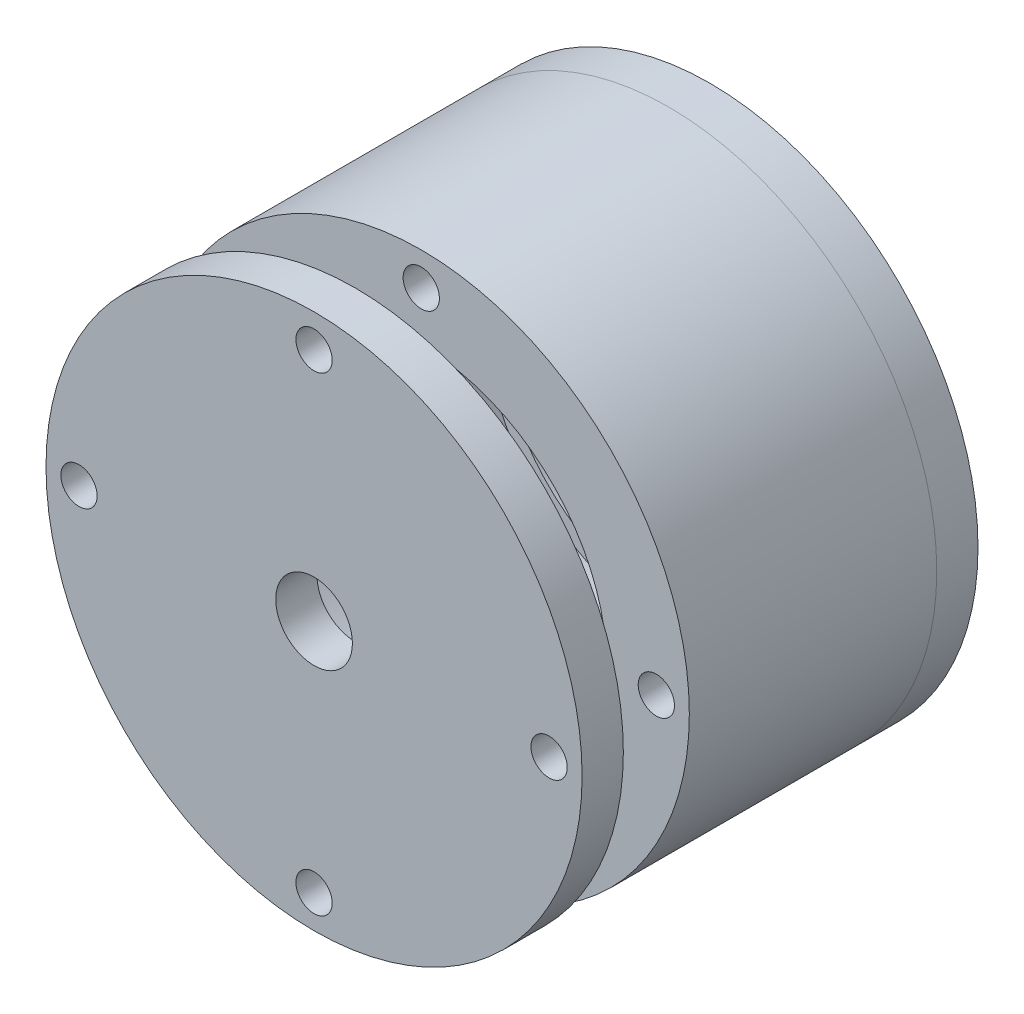
ISO-10303-21;
HEADER;
FILE_DESCRIPTION(('STEP AP214'),'2;1');
FILE_NAME('part.step','',(''),(''),'','','');
FILE_SCHEMA(('AUTOMOTIVE_DESIGN { 1 0 10303 214 1 1 1 1 }'));
ENDSEC;
DATA;
#1=APPLICATION_CONTEXT('core data for automotive mechanical design processes');
#2=APPLICATION_PROTOCOL_DEFINITION('international standard','automotive_design',2000,#1);
#3=PRODUCT_CONTEXT('',#1,'mechanical');
#4=PRODUCT('Part','Part','',(#3));
#5=PRODUCT_RELATED_PRODUCT_CATEGORY('part','',(#4));
#6=PRODUCT_DEFINITION_FORMATION('','',#4);
#7=PRODUCT_DEFINITION_CONTEXT('part definition',#1,'design');
#8=PRODUCT_DEFINITION('design','',#6,#7);
#9=PRODUCT_DEFINITION_SHAPE('','',#8);
#10=(LENGTH_UNIT() NAMED_UNIT(*) SI_UNIT(.MILLI.,.METRE.));
#11=(NAMED_UNIT(*) PLANE_ANGLE_UNIT() SI_UNIT($,.RADIAN.));
#12=(NAMED_UNIT(*) SI_UNIT($,.STERADIAN.) SOLID_ANGLE_UNIT());
#13=UNCERTAINTY_MEASURE_WITH_UNIT(LENGTH_MEASURE(1.E-05),#10,'distance_accuracy_value','');
#14=(GEOMETRIC_REPRESENTATION_CONTEXT(3) GLOBAL_UNCERTAINTY_ASSIGNED_CONTEXT((#13)) GLOBAL_UNIT_ASSIGNED_CONTEXT((#10,
#11,#12)) REPRESENTATION_CONTEXT('',''));
#15=CARTESIAN_POINT('',(0.,0.,0.));
#16=DIRECTION('',(0.,0.,1.));
#17=DIRECTION('',(1.,0.,0.));
#18=AXIS2_PLACEMENT_3D('',#15,#16,#17);
#19=CARTESIAN_POINT('',(0.,0.,-38.));
#20=DIRECTION('',(0.,0.,-1.));
#21=DIRECTION('',(1.,0.,0.));
#22=AXIS2_PLACEMENT_3D('',#19,#20,#21);
#23=PLANE('',#22);
#24=CARTESIAN_POINT('',(33.4966210299385,-33.7547722369169,-38.));
#25=DIRECTION('',(0.,0.,1.));
#26=DIRECTION('',(1.,0.,0.));
#27=AXIS2_PLACEMENT_3D('',#24,#25,#26);
#28=CIRCLE('',#27,4.65);
#29=CARTESIAN_POINT('',(38.1466210299385,-33.7547722369169,-38.));
#30=VERTEX_POINT('',#29);
#31=EDGE_CURVE('E88',#30,#30,#28,.T.);
#32=ORIENTED_EDGE('',*,*,#31,.F.);
#33=EDGE_LOOP('',(#32));
#34=FACE_BOUND('',#33,.T.);
#35=CARTESIAN_POINT('',(33.4966210299385,-33.7547722369169,-38.));
#36=DIRECTION('',(0.,0.,1.));
#37=DIRECTION('',(1.,0.,0.));
#38=AXIS2_PLACEMENT_3D('',#35,#36,#37);
#39=CIRCLE('',#38,15.6);
#40=CARTESIAN_POINT('',(49.0966210299385,-33.7547722369169,-38.));
#41=VERTEX_POINT('',#40);
#42=EDGE_CURVE('E141',#41,#41,#39,.T.);
#43=ORIENTED_EDGE('',*,*,#42,.T.);
#44=EDGE_LOOP('',(#43));
#45=FACE_BOUND('',#44,.T.);
#46=ADVANCED_FACE('F56',(#34,#45),#23,.F.);
#47=CARTESIAN_POINT('',(61.9966210299385,-33.7547722369169,-43.));
#48=DIRECTION('',(0.,0.,1.));
#49=DIRECTION('',(-1.,0.,0.));
#50=AXIS2_PLACEMENT_3D('',#47,#48,#49);
#51=CYLINDRICAL_SURFACE('',#50,2.2);
#52=CARTESIAN_POINT('',(61.9966210299385,-33.7547722369169,-43.));
#53=DIRECTION('',(0.,0.,1.));
#54=DIRECTION('',(1.,0.,0.));
#55=AXIS2_PLACEMENT_3D('',#52,#53,#54);
#56=CIRCLE('',#55,2.2);
#57=CARTESIAN_POINT('',(64.1966210299385,-33.7547722369169,-43.));
#58=VERTEX_POINT('',#57);
#59=EDGE_CURVE('E65',#58,#58,#56,.T.);
#60=ORIENTED_EDGE('',*,*,#59,.F.);
#61=EDGE_LOOP('',(#60));
#62=FACE_BOUND('',#61,.T.);
#63=CARTESIAN_POINT('',(61.9966210299385,-33.7547722369169,-38.));
#64=DIRECTION('',(0.,0.,1.));
#65=DIRECTION('',(1.,0.,0.));
#66=AXIS2_PLACEMENT_3D('',#63,#64,#65);
#67=CIRCLE('',#66,2.2);
#68=CARTESIAN_POINT('',(64.1966210299385,-33.7547722369169,-38.));
#69=VERTEX_POINT('',#68);
#70=EDGE_CURVE('E91',#69,#69,#67,.T.);
#71=ORIENTED_EDGE('',*,*,#70,.T.);
#72=EDGE_LOOP('',(#71));
#73=FACE_BOUND('',#72,.T.);
#74=ADVANCED_FACE('F131',(#62,#73),#51,.F.);
#75=CARTESIAN_POINT('',(33.4966210299385,-33.7547722369169,-43.));
#76=DIRECTION('',(0.,0.,1.));
#77=DIRECTION('',(-1.,0.,0.));
#78=AXIS2_PLACEMENT_3D('',#75,#76,#77);
#79=CYLINDRICAL_SURFACE('',#78,4.65);
#80=CARTESIAN_POINT('',(33.4966210299385,-33.7547722369169,-43.));
#81=DIRECTION('',(0.,0.,1.));
#82=DIRECTION('',(1.,0.,0.));
#83=AXIS2_PLACEMENT_3D('',#80,#81,#82);
#84=CIRCLE('',#83,4.65);
#85=CARTESIAN_POINT('',(38.1466210299385,-33.7547722369169,-43.));
#86=VERTEX_POINT('',#85);
#87=EDGE_CURVE('E72',#86,#86,#84,.T.);
#88=ORIENTED_EDGE('',*,*,#87,.F.);
#89=EDGE_LOOP('',(#88));
#90=FACE_BOUND('',#89,.T.);
#91=ORIENTED_EDGE('',*,*,#31,.T.);
#92=EDGE_LOOP('',(#91));
#93=FACE_BOUND('',#92,.T.);
#94=ADVANCED_FACE('F127',(#90,#93),#79,.F.);
#95=CARTESIAN_POINT('',(33.4966210299385,-62.2547722369169,-43.));
#96=DIRECTION('',(0.,0.,1.));
#97=DIRECTION('',(-1.,0.,0.));
#98=AXIS2_PLACEMENT_3D('',#95,#96,#97);
#99=CYLINDRICAL_SURFACE('',#98,2.2);
#100=CARTESIAN_POINT('',(33.4966210299385,-62.2547722369169,-43.));
#101=DIRECTION('',(0.,0.,1.));
#102=DIRECTION('',(1.,0.,0.));
#103=AXIS2_PLACEMENT_3D('',#100,#101,#102);
#104=CIRCLE('',#103,2.2);
#105=CARTESIAN_POINT('',(35.6966210299385,-62.2547722369169,-43.));
#106=VERTEX_POINT('',#105);
#107=EDGE_CURVE('E112',#106,#106,#104,.T.);
#108=ORIENTED_EDGE('',*,*,#107,.F.);
#109=EDGE_LOOP('',(#108));
#110=FACE_BOUND('',#109,.T.);
#111=CARTESIAN_POINT('',(33.4966210299385,-62.2547722369169,-38.));
#112=DIRECTION('',(0.,0.,1.));
#113=DIRECTION('',(1.,0.,0.));
#114=AXIS2_PLACEMENT_3D('',#111,#112,#113);
#115=CIRCLE('',#114,2.2);
#116=CARTESIAN_POINT('',(35.6966210299385,-62.2547722369169,-38.));
#117=VERTEX_POINT('',#116);
#118=EDGE_CURVE('E84',#117,#117,#115,.T.);
#119=ORIENTED_EDGE('',*,*,#118,.T.);
#120=EDGE_LOOP('',(#119));
#121=FACE_BOUND('',#120,.T.);
#122=ADVANCED_FACE('F130',(#110,#121),#99,.F.);
#123=CARTESIAN_POINT('',(4.9966210299385,-33.7547722369169,-43.));
#124=DIRECTION('',(0.,0.,1.));
#125=DIRECTION('',(-1.,0.,0.));
#126=AXIS2_PLACEMENT_3D('',#123,#124,#125);
#127=CYLINDRICAL_SURFACE('',#126,2.2);
#128=CARTESIAN_POINT('',(4.9966210299385,-33.7547722369169,-43.));
#129=DIRECTION('',(0.,0.,1.));
#130=DIRECTION('',(1.,0.,0.));
#131=AXIS2_PLACEMENT_3D('',#128,#129,#130);
#132=CIRCLE('',#131,2.2);
#133=CARTESIAN_POINT('',(7.1966210299385,-33.7547722369169,-43.));
#134=VERTEX_POINT('',#133);
#135=EDGE_CURVE('E105',#134,#134,#132,.T.);
#136=ORIENTED_EDGE('',*,*,#135,.F.);
#137=EDGE_LOOP('',(#136));
#138=FACE_BOUND('',#137,.T.);
#139=CARTESIAN_POINT('',(4.9966210299385,-33.7547722369169,-38.));
#140=DIRECTION('',(0.,0.,1.));
#141=DIRECTION('',(1.,0.,0.));
#142=AXIS2_PLACEMENT_3D('',#139,#140,#141);
#143=CIRCLE('',#142,2.2);
#144=CARTESIAN_POINT('',(7.1966210299385,-33.7547722369169,-38.));
#145=VERTEX_POINT('',#144);
#146=EDGE_CURVE('E80',#145,#145,#143,.T.);
#147=ORIENTED_EDGE('',*,*,#146,.T.);
#148=EDGE_LOOP('',(#147));
#149=FACE_BOUND('',#148,.T.);
#150=ADVANCED_FACE('F166',(#138,#149),#127,.F.);
#151=CARTESIAN_POINT('',(33.4966210299385,-5.25477223691686,-43.));
#152=DIRECTION('',(0.,0.,1.));
#153=DIRECTION('',(-1.,0.,0.));
#154=AXIS2_PLACEMENT_3D('',#151,#152,#153);
#155=CYLINDRICAL_SURFACE('',#154,2.2);
#156=CARTESIAN_POINT('',(33.4966210299385,-5.25477223691686,-43.));
#157=DIRECTION('',(0.,0.,1.));
#158=DIRECTION('',(1.,0.,0.));
#159=AXIS2_PLACEMENT_3D('',#156,#157,#158);
#160=CIRCLE('',#159,2.2);
#161=CARTESIAN_POINT('',(35.6966210299385,-5.25477223691686,-43.));
#162=VERTEX_POINT('',#161);
#163=EDGE_CURVE('E100',#162,#162,#160,.T.);
#164=ORIENTED_EDGE('',*,*,#163,.F.);
#165=EDGE_LOOP('',(#164));
#166=FACE_BOUND('',#165,.T.);
#167=CARTESIAN_POINT('',(33.4966210299385,-5.25477223691686,-38.));
#168=DIRECTION('',(0.,0.,1.));
#169=DIRECTION('',(1.,0.,0.));
#170=AXIS2_PLACEMENT_3D('',#167,#168,#169);
#171=CIRCLE('',#170,2.2);
#172=CARTESIAN_POINT('',(35.6966210299385,-5.25477223691686,-38.));
#173=VERTEX_POINT('',#172);
#174=EDGE_CURVE('E76',#173,#173,#171,.T.);
#175=ORIENTED_EDGE('',*,*,#174,.T.);
#176=EDGE_LOOP('',(#175));
#177=FACE_BOUND('',#176,.T.);
#178=ADVANCED_FACE('F58',(#166,#177),#155,.F.);
#179=CARTESIAN_POINT('',(33.4966210299385,-33.7547722369169,-43.));
#180=DIRECTION('',(0.,0.,1.));
#181=DIRECTION('',(-1.,0.,0.));
#182=AXIS2_PLACEMENT_3D('',#179,#180,#181);
#183=CYLINDRICAL_SURFACE('',#182,32.5);
#184=CARTESIAN_POINT('',(33.4966210299385,-33.7547722369169,-43.));
#185=DIRECTION('',(0.,0.,1.));
#186=DIRECTION('',(1.,0.,0.));
#187=AXIS2_PLACEMENT_3D('',#184,#185,#186);
#188=CIRCLE('',#187,32.5);
#189=CARTESIAN_POINT('',(65.9966210299385,-33.7547722369169,-43.));
#190=VERTEX_POINT('',#189);
#191=EDGE_CURVE('E13',#190,#190,#188,.T.);
#192=ORIENTED_EDGE('',*,*,#191,.T.);
#193=EDGE_LOOP('',(#192));
#194=FACE_BOUND('',#193,.T.);
#195=CARTESIAN_POINT('',(33.4966210299385,-33.7547722369169,-38.));
#196=DIRECTION('',(0.,0.,1.));
#197=DIRECTION('',(1.,0.,0.));
#198=AXIS2_PLACEMENT_3D('',#195,#196,#197);
#199=CIRCLE('',#198,32.5);
#200=CARTESIAN_POINT('',(65.9966210299385,-33.7547722369169,-38.));
#201=VERTEX_POINT('',#200);
#202=EDGE_CURVE('E60',#201,#201,#199,.T.);
#203=ORIENTED_EDGE('',*,*,#202,.F.);
#204=EDGE_LOOP('',(#203));
#205=FACE_BOUND('',#204,.T.);
#206=ADVANCED_FACE('F178',(#194,#205),#183,.T.);
#207=CARTESIAN_POINT('',(0.,0.,-43.));
#208=DIRECTION('',(0.,0.,-1.));
#209=DIRECTION('',(1.,0.,0.));
#210=AXIS2_PLACEMENT_3D('',#207,#208,#209);
#211=PLANE('',#210);
#212=ORIENTED_EDGE('',*,*,#163,.T.);
#213=EDGE_LOOP('',(#212));
#214=FACE_BOUND('',#213,.T.);
#215=ORIENTED_EDGE('',*,*,#135,.T.);
#216=EDGE_LOOP('',(#215));
#217=FACE_BOUND('',#216,.T.);
#218=ORIENTED_EDGE('',*,*,#107,.T.);
#219=EDGE_LOOP('',(#218));
#220=FACE_BOUND('',#219,.T.);
#221=ORIENTED_EDGE('',*,*,#87,.T.);
#222=EDGE_LOOP('',(#221));
#223=FACE_BOUND('',#222,.T.);
#224=ORIENTED_EDGE('',*,*,#59,.T.);
#225=EDGE_LOOP('',(#224));
#226=FACE_BOUND('',#225,.T.);
#227=ORIENTED_EDGE('',*,*,#191,.F.);
#228=EDGE_LOOP('',(#227));
#229=FACE_BOUND('',#228,.T.);
#230=ADVANCED_FACE('F124',(#214,#217,#220,#223,#226,#229),#211,.T.);
#231=CARTESIAN_POINT('',(33.4966210299385,-33.7547722369169,-38.));
#232=DIRECTION('',(0.,0.,1.));
#233=DIRECTION('',(1.,0.,0.));
#234=AXIS2_PLACEMENT_3D('',#231,#232,#233);
#235=CIRCLE('',#234,20.6);
#236=CARTESIAN_POINT('',(54.0966210299385,-33.7547722369169,-38.));
#237=VERTEX_POINT('',#236);
#238=EDGE_CURVE('E115',#237,#237,#235,.T.);
#239=ORIENTED_EDGE('',*,*,#238,.F.);
#240=EDGE_LOOP('',(#239));
#241=FACE_BOUND('',#240,.T.);
#242=ORIENTED_EDGE('',*,*,#174,.F.);
#243=EDGE_LOOP('',(#242));
#244=FACE_BOUND('',#243,.T.);
#245=ORIENTED_EDGE('',*,*,#146,.F.);
#246=EDGE_LOOP('',(#245));
#247=FACE_BOUND('',#246,.T.);
#248=ORIENTED_EDGE('',*,*,#118,.F.);
#249=EDGE_LOOP('',(#248));
#250=FACE_BOUND('',#249,.T.);
#251=ORIENTED_EDGE('',*,*,#70,.F.);
#252=EDGE_LOOP('',(#251));
#253=FACE_BOUND('',#252,.T.);
#254=ORIENTED_EDGE('',*,*,#202,.T.);
#255=EDGE_LOOP('',(#254));
#256=FACE_BOUND('',#255,.T.);
#257=ADVANCED_FACE('F138',(#241,#244,#247,#250,#253,#256),#23,.F.);
#258=CARTESIAN_POINT('',(33.4966210299385,-33.7547722369169,-40.5));
#259=DIRECTION('',(0.,0.,1.));
#260=DIRECTION('',(1.,0.,0.));
#261=AXIS2_PLACEMENT_3D('',#258,#259,#260);
#262=CYLINDRICAL_SURFACE('',#261,20.6);
#263=CARTESIAN_POINT('',(33.4966210299385,-33.7547722369169,-40.5));
#264=DIRECTION('',(0.,0.,1.));
#265=DIRECTION('',(1.,0.,0.));
#266=AXIS2_PLACEMENT_3D('',#263,#264,#265);
#267=CIRCLE('',#266,20.6);
#268=CARTESIAN_POINT('',(54.0966210299385,-33.7547722369169,-40.5));
#269=VERTEX_POINT('',#268);
#270=EDGE_CURVE('E81',#269,#269,#267,.T.);
#271=ORIENTED_EDGE('',*,*,#270,.F.);
#272=EDGE_LOOP('',(#271));
#273=FACE_BOUND('',#272,.T.);
#274=ORIENTED_EDGE('',*,*,#238,.T.);
#275=EDGE_LOOP('',(#274));
#276=FACE_BOUND('',#275,.T.);
#277=ADVANCED_FACE('F154',(#273,#276),#262,.F.);
#278=CARTESIAN_POINT('',(33.4966210299385,-33.7547722369169,-40.5));
#279=DIRECTION('',(0.,0.,1.));
#280=DIRECTION('',(1.,0.,0.));
#281=AXIS2_PLACEMENT_3D('',#278,#279,#280);
#282=PLANE('',#281);
#283=CARTESIAN_POINT('',(33.4966210299385,-33.7547722369169,-40.5));
#284=DIRECTION('',(0.,0.,1.));
#285=DIRECTION('',(1.,0.,0.));
#286=AXIS2_PLACEMENT_3D('',#283,#284,#285);
#287=CIRCLE('',#286,15.6);
#288=CARTESIAN_POINT('',(49.0966210299385,-33.7547722369169,-40.5));
#289=VERTEX_POINT('',#288);
#290=EDGE_CURVE('E144',#289,#289,#287,.T.);
#291=ORIENTED_EDGE('',*,*,#290,.F.);
#292=EDGE_LOOP('',(#291));
#293=FACE_BOUND('',#292,.T.);
#294=ORIENTED_EDGE('',*,*,#270,.T.);
#295=EDGE_LOOP('',(#294));
#296=FACE_BOUND('',#295,.T.);
#297=ADVANCED_FACE('F185',(#293,#296),#282,.T.);
#298=CARTESIAN_POINT('',(33.4966210299385,-33.7547722369169,-40.5));
#299=DIRECTION('',(0.,0.,1.));
#300=DIRECTION('',(1.,0.,0.));
#301=AXIS2_PLACEMENT_3D('',#298,#299,#300);
#302=CYLINDRICAL_SURFACE('',#301,15.6);
#303=ORIENTED_EDGE('',*,*,#290,.T.);
#304=EDGE_LOOP('',(#303));
#305=FACE_BOUND('',#304,.T.);
#306=ORIENTED_EDGE('',*,*,#42,.F.);
#307=EDGE_LOOP('',(#306));
#308=FACE_BOUND('',#307,.T.);
#309=ADVANCED_FACE('F189',(#305,#308),#302,.T.);
#310=CLOSED_SHELL('',(#46,#74,#94,#122,#150,#178,#206,#230,#257,#277,#297,#309));
#311=MANIFOLD_SOLID_BREP('B2',#310);
#312=CARTESIAN_POINT('',(33.4966210299385,-62.2547722369169,-38.));
#313=DIRECTION('',(0.,0.,1.));
#314=DIRECTION('',(1.,0.,0.));
#315=AXIS2_PLACEMENT_3D('',#312,#313,#314);
#316=CYLINDRICAL_SURFACE('',#315,2.2);
#317=CARTESIAN_POINT('',(33.4966210299385,-62.2547722369169,-38.));
#318=DIRECTION('',(0.,0.,-1.));
#319=DIRECTION('',(-1.,0.,0.));
#320=AXIS2_PLACEMENT_3D('',#317,#318,#319);
#321=CIRCLE('',#320,2.2);
#322=CARTESIAN_POINT('',(31.2966210299385,-62.2547722369169,-38.));
#323=VERTEX_POINT('',#322);
#324=EDGE_CURVE('E359',#323,#323,#321,.F.);
#325=ORIENTED_EDGE('',*,*,#324,.F.);
#326=EDGE_LOOP('',(#325));
#327=FACE_BOUND('',#326,.T.);
#328=CARTESIAN_POINT('',(33.4966210299385,-62.2547722369169,-8.));
#329=DIRECTION('',(0.,0.,-1.));
#330=DIRECTION('',(-1.,0.,0.));
#331=AXIS2_PLACEMENT_3D('',#328,#329,#330);
#332=CIRCLE('',#331,2.2);
#333=CARTESIAN_POINT('',(31.2966210299385,-62.2547722369169,-8.));
#334=VERTEX_POINT('',#333);
#335=EDGE_CURVE('E385',#334,#334,#332,.F.);
#336=ORIENTED_EDGE('',*,*,#335,.T.);
#337=EDGE_LOOP('',(#336));
#338=FACE_BOUND('',#337,.T.);
#339=ADVANCED_FACE('F350',(#327,#338),#316,.F.);
#340=CARTESIAN_POINT('',(61.9966210299385,-33.7547722369169,-38.));
#341=DIRECTION('',(0.,0.,1.));
#342=DIRECTION('',(1.,0.,0.));
#343=AXIS2_PLACEMENT_3D('',#340,#341,#342);
#344=CYLINDRICAL_SURFACE('',#343,2.2);
#345=CARTESIAN_POINT('',(61.9966210299385,-33.7547722369169,-38.));
#346=DIRECTION('',(0.,0.,-1.));
#347=DIRECTION('',(-1.,0.,0.));
#348=AXIS2_PLACEMENT_3D('',#345,#346,#347);
#349=CIRCLE('',#348,2.2);
#350=CARTESIAN_POINT('',(59.7966210299385,-33.7547722369169,-38.));
#351=VERTEX_POINT('',#350);
#352=EDGE_CURVE('E366',#351,#351,#349,.F.);
#353=ORIENTED_EDGE('',*,*,#352,.F.);
#354=EDGE_LOOP('',(#353));
#355=FACE_BOUND('',#354,.T.);
#356=CARTESIAN_POINT('',(61.9966210299385,-33.7547722369169,-8.));
#357=DIRECTION('',(0.,0.,-1.));
#358=DIRECTION('',(-1.,0.,0.));
#359=AXIS2_PLACEMENT_3D('',#356,#357,#358);
#360=CIRCLE('',#359,2.2);
#361=CARTESIAN_POINT('',(59.7966210299385,-33.7547722369169,-8.));
#362=VERTEX_POINT('',#361);
#363=EDGE_CURVE('E382',#362,#362,#360,.F.);
#364=ORIENTED_EDGE('',*,*,#363,.T.);
#365=EDGE_LOOP('',(#364));
#366=FACE_BOUND('',#365,.T.);
#367=ADVANCED_FACE('F414',(#355,#366),#344,.F.);
#368=CARTESIAN_POINT('',(4.9966210299385,-33.7547722369169,-38.));
#369=DIRECTION('',(0.,0.,1.));
#370=DIRECTION('',(1.,0.,0.));
#371=AXIS2_PLACEMENT_3D('',#368,#369,#370);
#372=CYLINDRICAL_SURFACE('',#371,2.2);
#373=CARTESIAN_POINT('',(4.9966210299385,-33.7547722369169,-38.));
#374=DIRECTION('',(0.,0.,-1.));
#375=DIRECTION('',(-1.,0.,0.));
#376=AXIS2_PLACEMENT_3D('',#373,#374,#375);
#377=CIRCLE('',#376,2.2);
#378=CARTESIAN_POINT('',(2.7966210299385,-33.7547722369169,-38.));
#379=VERTEX_POINT('',#378);
#380=EDGE_CURVE('E404',#379,#379,#377,.F.);
#381=ORIENTED_EDGE('',*,*,#380,.F.);
#382=EDGE_LOOP('',(#381));
#383=FACE_BOUND('',#382,.T.);
#384=CARTESIAN_POINT('',(4.9966210299385,-33.7547722369169,-8.));
#385=DIRECTION('',(0.,0.,-1.));
#386=DIRECTION('',(-1.,0.,0.));
#387=AXIS2_PLACEMENT_3D('',#384,#385,#386);
#388=CIRCLE('',#387,2.2);
#389=CARTESIAN_POINT('',(2.7966210299385,-33.7547722369169,-8.));
#390=VERTEX_POINT('',#389);
#391=EDGE_CURVE('E378',#390,#390,#388,.F.);
#392=ORIENTED_EDGE('',*,*,#391,.T.);
#393=EDGE_LOOP('',(#392));
#394=FACE_BOUND('',#393,.T.);
#395=ADVANCED_FACE('F417',(#383,#394),#372,.F.);
#396=CARTESIAN_POINT('',(33.4966210299385,-33.7547722369169,-38.));
#397=DIRECTION('',(0.,0.,1.));
#398=DIRECTION('',(1.,0.,0.));
#399=AXIS2_PLACEMENT_3D('',#396,#397,#398);
#400=CYLINDRICAL_SURFACE('',#399,32.5);
#401=CARTESIAN_POINT('',(33.4966210299385,-33.7547722369169,-38.));
#402=DIRECTION('',(0.,0.,-1.));
#403=DIRECTION('',(-1.,0.,0.));
#404=AXIS2_PLACEMENT_3D('',#401,#402,#403);
#405=CIRCLE('',#404,32.5);
#406=CARTESIAN_POINT('',(0.996621029938492,-33.7547722369169,-38.));
#407=VERTEX_POINT('',#406);
#408=EDGE_CURVE('E397',#407,#407,#405,.T.);
#409=ORIENTED_EDGE('',*,*,#408,.F.);
#410=EDGE_LOOP('',(#409));
#411=FACE_BOUND('',#410,.T.);
#412=CARTESIAN_POINT('',(33.4966210299385,-33.7547722369169,-8.));
#413=DIRECTION('',(0.,0.,-1.));
#414=DIRECTION('',(-1.,0.,0.));
#415=AXIS2_PLACEMENT_3D('',#412,#413,#414);
#416=CIRCLE('',#415,32.5);
#417=CARTESIAN_POINT('',(0.996621029938492,-33.7547722369169,-8.));
#418=VERTEX_POINT('',#417);
#419=EDGE_CURVE('E374',#418,#418,#416,.T.);
#420=ORIENTED_EDGE('',*,*,#419,.T.);
#421=EDGE_LOOP('',(#420));
#422=FACE_BOUND('',#421,.T.);
#423=ADVANCED_FACE('F443',(#411,#422),#400,.T.);
#424=CARTESIAN_POINT('',(33.4966210299385,-33.7547722369169,-38.));
#425=DIRECTION('',(0.,0.,1.));
#426=DIRECTION('',(1.,0.,0.));
#427=AXIS2_PLACEMENT_3D('',#424,#425,#426);
#428=CYLINDRICAL_SURFACE('',#427,22.5);
#429=CARTESIAN_POINT('',(33.4966210299385,-33.7547722369169,-38.));
#430=DIRECTION('',(0.,0.,-1.));
#431=DIRECTION('',(-1.,0.,0.));
#432=AXIS2_PLACEMENT_3D('',#429,#430,#431);
#433=CIRCLE('',#432,22.5);
#434=CARTESIAN_POINT('',(10.9966210299385,-33.7547722369169,-38.));
#435=VERTEX_POINT('',#434);
#436=EDGE_CURVE('E391',#435,#435,#433,.T.);
#437=ORIENTED_EDGE('',*,*,#436,.T.);
#438=EDGE_LOOP('',(#437));
#439=FACE_BOUND('',#438,.T.);
#440=CARTESIAN_POINT('',(33.4966210299385,-33.7547722369169,-8.));
#441=DIRECTION('',(0.,0.,-1.));
#442=DIRECTION('',(-1.,0.,0.));
#443=AXIS2_PLACEMENT_3D('',#440,#441,#442);
#444=CIRCLE('',#443,22.5);
#445=CARTESIAN_POINT('',(10.9966210299385,-33.7547722369169,-8.));
#446=VERTEX_POINT('',#445);
#447=EDGE_CURVE('E370',#446,#446,#444,.T.);
#448=ORIENTED_EDGE('',*,*,#447,.F.);
#449=EDGE_LOOP('',(#448));
#450=FACE_BOUND('',#449,.T.);
#451=ADVANCED_FACE('F352',(#439,#450),#428,.F.);
#452=CARTESIAN_POINT('',(33.4966210299385,-5.25477223691686,-38.));
#453=DIRECTION('',(0.,0.,1.));
#454=DIRECTION('',(1.,0.,0.));
#455=AXIS2_PLACEMENT_3D('',#452,#453,#454);
#456=CYLINDRICAL_SURFACE('',#455,2.2);
#457=CARTESIAN_POINT('',(33.4966210299385,-5.25477223691686,-38.));
#458=DIRECTION('',(0.,0.,-1.));
#459=DIRECTION('',(-1.,0.,0.));
#460=AXIS2_PLACEMENT_3D('',#457,#458,#459);
#461=CIRCLE('',#460,2.2);
#462=CARTESIAN_POINT('',(31.2966210299385,-5.25477223691686,-38.));
#463=VERTEX_POINT('',#462);
#464=EDGE_CURVE('E55',#463,#463,#461,.F.);
#465=ORIENTED_EDGE('',*,*,#464,.F.);
#466=EDGE_LOOP('',(#465));
#467=FACE_BOUND('',#466,.T.);
#468=CARTESIAN_POINT('',(33.4966210299385,-5.25477223691686,-8.));
#469=DIRECTION('',(0.,0.,-1.));
#470=DIRECTION('',(-1.,0.,0.));
#471=AXIS2_PLACEMENT_3D('',#468,#469,#470);
#472=CIRCLE('',#471,2.2);
#473=CARTESIAN_POINT('',(31.2966210299385,-5.25477223691686,-8.));
#474=VERTEX_POINT('',#473);
#475=EDGE_CURVE('E354',#474,#474,#472,.F.);
#476=ORIENTED_EDGE('',*,*,#475,.T.);
#477=EDGE_LOOP('',(#476));
#478=FACE_BOUND('',#477,.T.);
#479=ADVANCED_FACE('F430',(#467,#478),#456,.F.);
#480=CARTESIAN_POINT('',(0.,0.,-38.));
#481=DIRECTION('',(0.,0.,-1.));
#482=DIRECTION('',(-1.,0.,0.));
#483=AXIS2_PLACEMENT_3D('',#480,#481,#482);
#484=PLANE('',#483);
#485=ORIENTED_EDGE('',*,*,#436,.F.);
#486=EDGE_LOOP('',(#485));
#487=FACE_BOUND('',#486,.T.);
#488=ORIENTED_EDGE('',*,*,#408,.T.);
#489=EDGE_LOOP('',(#488));
#490=FACE_BOUND('',#489,.T.);
#491=ORIENTED_EDGE('',*,*,#380,.T.);
#492=EDGE_LOOP('',(#491));
#493=FACE_BOUND('',#492,.T.);
#494=ORIENTED_EDGE('',*,*,#352,.T.);
#495=EDGE_LOOP('',(#494));
#496=FACE_BOUND('',#495,.T.);
#497=ORIENTED_EDGE('',*,*,#324,.T.);
#498=EDGE_LOOP('',(#497));
#499=FACE_BOUND('',#498,.T.);
#500=ORIENTED_EDGE('',*,*,#464,.T.);
#501=EDGE_LOOP('',(#500));
#502=FACE_BOUND('',#501,.T.);
#503=ADVANCED_FACE('F411',(#487,#490,#493,#496,#499,#502),#484,.T.);
#504=CARTESIAN_POINT('',(0.,0.,-8.));
#505=DIRECTION('',(0.,0.,-1.));
#506=DIRECTION('',(-1.,0.,0.));
#507=AXIS2_PLACEMENT_3D('',#504,#505,#506);
#508=PLANE('',#507);
#509=ORIENTED_EDGE('',*,*,#447,.T.);
#510=EDGE_LOOP('',(#509));
#511=FACE_BOUND('',#510,.T.);
#512=ORIENTED_EDGE('',*,*,#419,.F.);
#513=EDGE_LOOP('',(#512));
#514=FACE_BOUND('',#513,.T.);
#515=ORIENTED_EDGE('',*,*,#391,.F.);
#516=EDGE_LOOP('',(#515));
#517=FACE_BOUND('',#516,.T.);
#518=ORIENTED_EDGE('',*,*,#363,.F.);
#519=EDGE_LOOP('',(#518));
#520=FACE_BOUND('',#519,.T.);
#521=ORIENTED_EDGE('',*,*,#335,.F.);
#522=EDGE_LOOP('',(#521));
#523=FACE_BOUND('',#522,.T.);
#524=ORIENTED_EDGE('',*,*,#475,.F.);
#525=EDGE_LOOP('',(#524));
#526=FACE_BOUND('',#525,.T.);
#527=ADVANCED_FACE('F421',(#511,#514,#517,#520,#523,#526),#508,.F.);
#528=CLOSED_SHELL('',(#339,#367,#395,#423,#451,#479,#503,#527));
#529=MANIFOLD_SOLID_BREP('B8',#528);
#530=CARTESIAN_POINT('',(0.,0.,0.));
#531=DIRECTION('',(0.,0.,1.));
#532=DIRECTION('',(1.,0.,0.));
#533=AXIS2_PLACEMENT_3D('',#530,#531,#532);
#534=PLANE('',#533);
#535=CARTESIAN_POINT('',(33.4966210299385,-33.7547722369169,0.));
#536=DIRECTION('',(0.,0.,1.));
#537=DIRECTION('',(1.,0.,0.));
#538=AXIS2_PLACEMENT_3D('',#535,#536,#537);
#539=CIRCLE('',#538,4.65);
#540=CARTESIAN_POINT('',(38.1466210299385,-33.7547722369169,0.));
#541=VERTEX_POINT('',#540);
#542=EDGE_CURVE('E563',#541,#541,#539,.T.);
#543=ORIENTED_EDGE('',*,*,#542,.T.);
#544=EDGE_LOOP('',(#543));
#545=FACE_BOUND('',#544,.T.);
#546=CARTESIAN_POINT('',(33.4966210299385,-33.7547722369169,0.));
#547=DIRECTION('',(0.,0.,1.));
#548=DIRECTION('',(1.,0.,0.));
#549=AXIS2_PLACEMENT_3D('',#546,#547,#548);
#550=CIRCLE('',#549,15.6);
#551=CARTESIAN_POINT('',(49.0966210299385,-33.7547722369169,0.));
#552=VERTEX_POINT('',#551);
#553=EDGE_CURVE('E534',#552,#552,#550,.F.);
#554=ORIENTED_EDGE('',*,*,#553,.T.);
#555=EDGE_LOOP('',(#554));
#556=FACE_BOUND('',#555,.T.);
#557=ADVANCED_FACE('F530',(#545,#556),#534,.F.);
#558=CARTESIAN_POINT('',(61.9966210299385,-33.7547722369169,5.));
#559=DIRECTION('',(0.,0.,-1.));
#560=DIRECTION('',(-1.,0.,0.));
#561=AXIS2_PLACEMENT_3D('',#558,#559,#560);
#562=CYLINDRICAL_SURFACE('',#561,2.2);
#563=CARTESIAN_POINT('',(61.9966210299385,-33.7547722369169,5.));
#564=DIRECTION('',(0.,0.,1.));
#565=DIRECTION('',(1.,0.,0.));
#566=AXIS2_PLACEMENT_3D('',#563,#564,#565);
#567=CIRCLE('',#566,2.2);
#568=CARTESIAN_POINT('',(64.1966210299385,-33.7547722369169,5.));
#569=VERTEX_POINT('',#568);
#570=EDGE_CURVE('E539',#569,#569,#567,.T.);
#571=ORIENTED_EDGE('',*,*,#570,.T.);
#572=EDGE_LOOP('',(#571));
#573=FACE_BOUND('',#572,.T.);
#574=CARTESIAN_POINT('',(61.9966210299385,-33.7547722369169,0.));
#575=DIRECTION('',(0.,0.,1.));
#576=DIRECTION('',(1.,0.,0.));
#577=AXIS2_PLACEMENT_3D('',#574,#575,#576);
#578=CIRCLE('',#577,2.2);
#579=CARTESIAN_POINT('',(64.1966210299385,-33.7547722369169,0.));
#580=VERTEX_POINT('',#579);
#581=EDGE_CURVE('E567',#580,#580,#578,.T.);
#582=ORIENTED_EDGE('',*,*,#581,.F.);
#583=EDGE_LOOP('',(#582));
#584=FACE_BOUND('',#583,.T.);
#585=ADVANCED_FACE('F617',(#573,#584),#562,.F.);
#586=CARTESIAN_POINT('',(33.4966210299385,-33.7547722369169,5.));
#587=DIRECTION('',(0.,0.,-1.));
#588=DIRECTION('',(-1.,0.,0.));
#589=AXIS2_PLACEMENT_3D('',#586,#587,#588);
#590=CYLINDRICAL_SURFACE('',#589,4.65);
#591=CARTESIAN_POINT('',(33.4966210299385,-33.7547722369169,5.));
#592=DIRECTION('',(0.,0.,1.));
#593=DIRECTION('',(1.,0.,0.));
#594=AXIS2_PLACEMENT_3D('',#591,#592,#593);
#595=CIRCLE('',#594,4.65);
#596=CARTESIAN_POINT('',(38.1466210299385,-33.7547722369169,5.));
#597=VERTEX_POINT('',#596);
#598=EDGE_CURVE('E547',#597,#597,#595,.T.);
#599=ORIENTED_EDGE('',*,*,#598,.T.);
#600=EDGE_LOOP('',(#599));
#601=FACE_BOUND('',#600,.T.);
#602=ORIENTED_EDGE('',*,*,#542,.F.);
#603=EDGE_LOOP('',(#602));
#604=FACE_BOUND('',#603,.T.);
#605=ADVANCED_FACE('F605',(#601,#604),#590,.F.);
#606=CARTESIAN_POINT('',(33.4966210299385,-62.2547722369169,5.));
#607=DIRECTION('',(0.,0.,-1.));
#608=DIRECTION('',(-1.,0.,0.));
#609=AXIS2_PLACEMENT_3D('',#606,#607,#608);
#610=CYLINDRICAL_SURFACE('',#609,2.2);
#611=CARTESIAN_POINT('',(33.4966210299385,-62.2547722369169,5.));
#612=DIRECTION('',(0.,0.,1.));
#613=DIRECTION('',(1.,0.,0.));
#614=AXIS2_PLACEMENT_3D('',#611,#612,#613);
#615=CIRCLE('',#614,2.2);
#616=CARTESIAN_POINT('',(35.6966210299385,-62.2547722369169,5.));
#617=VERTEX_POINT('',#616);
#618=EDGE_CURVE('E599',#617,#617,#615,.T.);
#619=ORIENTED_EDGE('',*,*,#618,.T.);
#620=EDGE_LOOP('',(#619));
#621=FACE_BOUND('',#620,.T.);
#622=CARTESIAN_POINT('',(33.4966210299385,-62.2547722369169,0.));
#623=DIRECTION('',(0.,0.,1.));
#624=DIRECTION('',(1.,0.,0.));
#625=AXIS2_PLACEMENT_3D('',#622,#623,#624);
#626=CIRCLE('',#625,2.2);
#627=CARTESIAN_POINT('',(35.6966210299385,-62.2547722369169,0.));
#628=VERTEX_POINT('',#627);
#629=EDGE_CURVE('E559',#628,#628,#626,.T.);
#630=ORIENTED_EDGE('',*,*,#629,.F.);
#631=EDGE_LOOP('',(#630));
#632=FACE_BOUND('',#631,.T.);
#633=ADVANCED_FACE('F687',(#621,#632),#610,.F.);
#634=CARTESIAN_POINT('',(4.9966210299385,-33.7547722369169,5.));
#635=DIRECTION('',(0.,0.,-1.));
#636=DIRECTION('',(-1.,0.,0.));
#637=AXIS2_PLACEMENT_3D('',#634,#635,#636);
#638=CYLINDRICAL_SURFACE('',#637,2.2);
#639=CARTESIAN_POINT('',(4.9966210299385,-33.7547722369169,5.));
#640=DIRECTION('',(0.,0.,1.));
#641=DIRECTION('',(1.,0.,0.));
#642=AXIS2_PLACEMENT_3D('',#639,#640,#641);
#643=CIRCLE('',#642,2.2);
#644=CARTESIAN_POINT('',(7.1966210299385,-33.7547722369169,5.));
#645=VERTEX_POINT('',#644);
#646=EDGE_CURVE('E595',#645,#645,#643,.T.);
#647=ORIENTED_EDGE('',*,*,#646,.T.);
#648=EDGE_LOOP('',(#647));
#649=FACE_BOUND('',#648,.T.);
#650=CARTESIAN_POINT('',(4.9966210299385,-33.7547722369169,0.));
#651=DIRECTION('',(0.,0.,1.));
#652=DIRECTION('',(1.,0.,0.));
#653=AXIS2_PLACEMENT_3D('',#650,#651,#652);
#654=CIRCLE('',#653,2.2);
#655=CARTESIAN_POINT('',(7.1966210299385,-33.7547722369169,0.));
#656=VERTEX_POINT('',#655);
#657=EDGE_CURVE('E555',#656,#656,#654,.T.);
#658=ORIENTED_EDGE('',*,*,#657,.F.);
#659=EDGE_LOOP('',(#658));
#660=FACE_BOUND('',#659,.T.);
#661=ADVANCED_FACE('F636',(#649,#660),#638,.F.);
#662=CARTESIAN_POINT('',(33.4966210299385,-5.25477223691686,5.));
#663=DIRECTION('',(0.,0.,-1.));
#664=DIRECTION('',(-1.,0.,0.));
#665=AXIS2_PLACEMENT_3D('',#662,#663,#664);
#666=CYLINDRICAL_SURFACE('',#665,2.2);
#667=CARTESIAN_POINT('',(33.4966210299385,-5.25477223691686,5.));
#668=DIRECTION('',(0.,0.,1.));
#669=DIRECTION('',(1.,0.,0.));
#670=AXIS2_PLACEMENT_3D('',#667,#668,#669);
#671=CIRCLE('',#670,2.2);
#672=CARTESIAN_POINT('',(35.6966210299385,-5.25477223691686,5.));
#673=VERTEX_POINT('',#672);
#674=EDGE_CURVE('E573',#673,#673,#671,.T.);
#675=ORIENTED_EDGE('',*,*,#674,.T.);
#676=EDGE_LOOP('',(#675));
#677=FACE_BOUND('',#676,.T.);
#678=CARTESIAN_POINT('',(33.4966210299385,-5.25477223691686,0.));
#679=DIRECTION('',(0.,0.,1.));
#680=DIRECTION('',(1.,0.,0.));
#681=AXIS2_PLACEMENT_3D('',#678,#679,#680);
#682=CIRCLE('',#681,2.2);
#683=CARTESIAN_POINT('',(35.6966210299385,-5.25477223691686,0.));
#684=VERTEX_POINT('',#683);
#685=EDGE_CURVE('E551',#684,#684,#682,.T.);
#686=ORIENTED_EDGE('',*,*,#685,.F.);
#687=EDGE_LOOP('',(#686));
#688=FACE_BOUND('',#687,.T.);
#689=ADVANCED_FACE('F532',(#677,#688),#666,.F.);
#690=CARTESIAN_POINT('',(33.4966210299385,-33.7547722369169,5.));
#691=DIRECTION('',(0.,0.,-1.));
#692=DIRECTION('',(-1.,0.,0.));
#693=AXIS2_PLACEMENT_3D('',#690,#691,#692);
#694=CYLINDRICAL_SURFACE('',#693,32.5);
#695=CARTESIAN_POINT('',(33.4966210299385,-33.7547722369169,5.));
#696=DIRECTION('',(0.,0.,1.));
#697=DIRECTION('',(1.,0.,0.));
#698=AXIS2_PLACEMENT_3D('',#695,#696,#697);
#699=CIRCLE('',#698,32.5);
#700=CARTESIAN_POINT('',(65.9966210299385,-33.7547722369169,5.));
#701=VERTEX_POINT('',#700);
#702=EDGE_CURVE('E349',#701,#701,#699,.T.);
#703=ORIENTED_EDGE('',*,*,#702,.F.);
#704=EDGE_LOOP('',(#703));
#705=FACE_BOUND('',#704,.T.);
#706=CARTESIAN_POINT('',(33.4966210299385,-33.7547722369169,0.));
#707=DIRECTION('',(0.,0.,1.));
#708=DIRECTION('',(1.,0.,0.));
#709=AXIS2_PLACEMENT_3D('',#706,#707,#708);
#710=CIRCLE('',#709,32.5);
#711=CARTESIAN_POINT('',(65.9966210299385,-33.7547722369169,0.));
#712=VERTEX_POINT('',#711);
#713=EDGE_CURVE('E571',#712,#712,#710,.T.);
#714=ORIENTED_EDGE('',*,*,#713,.T.);
#715=EDGE_LOOP('',(#714));
#716=FACE_BOUND('',#715,.T.);
#717=ADVANCED_FACE('F612',(#705,#716),#694,.T.);
#718=CARTESIAN_POINT('',(0.,0.,5.));
#719=DIRECTION('',(0.,0.,1.));
#720=DIRECTION('',(1.,0.,0.));
#721=AXIS2_PLACEMENT_3D('',#718,#719,#720);
#722=PLANE('',#721);
#723=ORIENTED_EDGE('',*,*,#674,.F.);
#724=EDGE_LOOP('',(#723));
#725=FACE_BOUND('',#724,.T.);
#726=ORIENTED_EDGE('',*,*,#646,.F.);
#727=EDGE_LOOP('',(#726));
#728=FACE_BOUND('',#727,.T.);
#729=ORIENTED_EDGE('',*,*,#618,.F.);
#730=EDGE_LOOP('',(#729));
#731=FACE_BOUND('',#730,.T.);
#732=ORIENTED_EDGE('',*,*,#598,.F.);
#733=EDGE_LOOP('',(#732));
#734=FACE_BOUND('',#733,.T.);
#735=ORIENTED_EDGE('',*,*,#570,.F.);
#736=EDGE_LOOP('',(#735));
#737=FACE_BOUND('',#736,.T.);
#738=ORIENTED_EDGE('',*,*,#702,.T.);
#739=EDGE_LOOP('',(#738));
#740=FACE_BOUND('',#739,.T.);
#741=ADVANCED_FACE('F608',(#725,#728,#731,#734,#737,#740),#722,.T.);
#742=CARTESIAN_POINT('',(33.4966210299385,-33.7547722369169,0.));
#743=DIRECTION('',(0.,0.,1.));
#744=DIRECTION('',(1.,0.,0.));
#745=AXIS2_PLACEMENT_3D('',#742,#743,#744);
#746=CIRCLE('',#745,20.6);
#747=CARTESIAN_POINT('',(54.0966210299385,-33.7547722369169,0.));
#748=VERTEX_POINT('',#747);
#749=EDGE_CURVE('E574',#748,#748,#746,.F.);
#750=ORIENTED_EDGE('',*,*,#749,.F.);
#751=EDGE_LOOP('',(#750));
#752=FACE_BOUND('',#751,.T.);
#753=ORIENTED_EDGE('',*,*,#685,.T.);
#754=EDGE_LOOP('',(#753));
#755=FACE_BOUND('',#754,.T.);
#756=ORIENTED_EDGE('',*,*,#657,.T.);
#757=EDGE_LOOP('',(#756));
#758=FACE_BOUND('',#757,.T.);
#759=ORIENTED_EDGE('',*,*,#629,.T.);
#760=EDGE_LOOP('',(#759));
#761=FACE_BOUND('',#760,.T.);
#762=ORIENTED_EDGE('',*,*,#581,.T.);
#763=EDGE_LOOP('',(#762));
#764=FACE_BOUND('',#763,.T.);
#765=ORIENTED_EDGE('',*,*,#713,.F.);
#766=EDGE_LOOP('',(#765));
#767=FACE_BOUND('',#766,.T.);
#768=ADVANCED_FACE('F611',(#752,#755,#758,#761,#764,#767),#534,.F.);
#769=CARTESIAN_POINT('',(33.4966210299385,-33.7547722369169,-101.265598769772));
#770=DIRECTION('',(0.,0.,1.));
#771=DIRECTION('',(1.,0.,0.));
#772=AXIS2_PLACEMENT_3D('',#769,#770,#771);
#773=CYLINDRICAL_SURFACE('',#772,15.6);
#774=CARTESIAN_POINT('',(33.4966210299385,-33.7547722369169,2.5));
#775=DIRECTION('',(0.,0.,-1.));
#776=DIRECTION('',(-1.,0.,0.));
#777=AXIS2_PLACEMENT_3D('',#774,#775,#776);
#778=CIRCLE('',#777,15.6);
#779=CARTESIAN_POINT('',(17.8966210299385,-33.7547722369169,2.5));
#780=VERTEX_POINT('',#779);
#781=EDGE_CURVE('E585',#780,#780,#778,.T.);
#782=ORIENTED_EDGE('',*,*,#781,.T.);
#783=EDGE_LOOP('',(#782));
#784=FACE_BOUND('',#783,.T.);
#785=ORIENTED_EDGE('',*,*,#553,.F.);
#786=EDGE_LOOP('',(#785));
#787=FACE_BOUND('',#786,.T.);
#788=ADVANCED_FACE('F625',(#784,#787),#773,.T.);
#789=CARTESIAN_POINT('',(33.4966210299385,-33.7547722369169,-101.265598769772));
#790=DIRECTION('',(0.,0.,1.));
#791=DIRECTION('',(1.,0.,0.));
#792=AXIS2_PLACEMENT_3D('',#789,#790,#791);
#793=CYLINDRICAL_SURFACE('',#792,20.6);
#794=CARTESIAN_POINT('',(33.4966210299385,-33.7547722369169,2.5));
#795=DIRECTION('',(0.,0.,-1.));
#796=DIRECTION('',(-1.,0.,0.));
#797=AXIS2_PLACEMENT_3D('',#794,#795,#796);
#798=CIRCLE('',#797,20.6);
#799=CARTESIAN_POINT('',(12.8966210299385,-33.7547722369169,2.5));
#800=VERTEX_POINT('',#799);
#801=EDGE_CURVE('E577',#800,#800,#798,.T.);
#802=ORIENTED_EDGE('',*,*,#801,.F.);
#803=EDGE_LOOP('',(#802));
#804=FACE_BOUND('',#803,.T.);
#805=ORIENTED_EDGE('',*,*,#749,.T.);
#806=EDGE_LOOP('',(#805));
#807=FACE_BOUND('',#806,.T.);
#808=ADVANCED_FACE('F644',(#804,#807),#793,.F.);
#809=CARTESIAN_POINT('',(0.,0.,2.5));
#810=DIRECTION('',(0.,0.,-1.));
#811=DIRECTION('',(-1.,0.,0.));
#812=AXIS2_PLACEMENT_3D('',#809,#810,#811);
#813=PLANE('',#812);
#814=ORIENTED_EDGE('',*,*,#781,.F.);
#815=EDGE_LOOP('',(#814));
#816=FACE_BOUND('',#815,.T.);
#817=ORIENTED_EDGE('',*,*,#801,.T.);
#818=EDGE_LOOP('',(#817));
#819=FACE_BOUND('',#818,.T.);
#820=ADVANCED_FACE('F647',(#816,#819),#813,.T.);
#821=CLOSED_SHELL('',(#557,#585,#605,#633,#661,#689,#717,#741,#768,#788,#808,#820));
#822=MANIFOLD_SOLID_BREP('B50',#821);
#823=ADVANCED_BREP_SHAPE_REPRESENTATION('',(#18,#311,#529,#822),#14);
#824=SHAPE_DEFINITION_REPRESENTATION(#9,#823);
ENDSEC;
END-ISO-10303-21;
